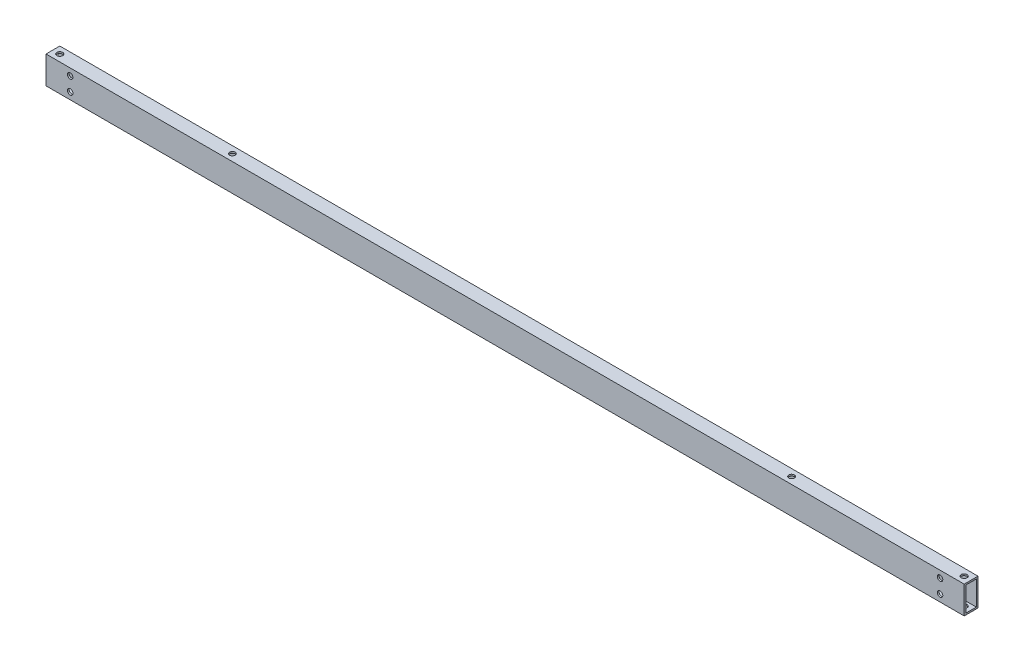
ISO-10303-21;
HEADER;
FILE_DESCRIPTION(('STEP AP214'),'2;1');
FILE_NAME('part.step','',(''),(''),'','','');
FILE_SCHEMA(('AUTOMOTIVE_DESIGN { 1 0 10303 214 1 1 1 1 }'));
ENDSEC;
DATA;
#1=APPLICATION_CONTEXT('core data for automotive mechanical design processes');
#2=APPLICATION_PROTOCOL_DEFINITION('international standard','automotive_design',2000,#1);
#3=PRODUCT_CONTEXT('',#1,'mechanical');
#4=PRODUCT('Part','Part','',(#3));
#5=PRODUCT_RELATED_PRODUCT_CATEGORY('part','',(#4));
#6=PRODUCT_DEFINITION_FORMATION('','',#4);
#7=PRODUCT_DEFINITION_CONTEXT('part definition',#1,'design');
#8=PRODUCT_DEFINITION('design','',#6,#7);
#9=PRODUCT_DEFINITION_SHAPE('','',#8);
#10=(LENGTH_UNIT() NAMED_UNIT(*) SI_UNIT(.MILLI.,.METRE.));
#11=(NAMED_UNIT(*) PLANE_ANGLE_UNIT() SI_UNIT($,.RADIAN.));
#12=(NAMED_UNIT(*) SI_UNIT($,.STERADIAN.) SOLID_ANGLE_UNIT());
#13=UNCERTAINTY_MEASURE_WITH_UNIT(LENGTH_MEASURE(1.E-05),#10,'distance_accuracy_value','');
#14=(GEOMETRIC_REPRESENTATION_CONTEXT(3) GLOBAL_UNCERTAINTY_ASSIGNED_CONTEXT((#13)) GLOBAL_UNIT_ASSIGNED_CONTEXT((#10,
#11,#12)) REPRESENTATION_CONTEXT('',''));
#15=CARTESIAN_POINT('',(0.,0.,0.));
#16=DIRECTION('',(0.,0.,1.));
#17=DIRECTION('',(1.,0.,0.));
#18=AXIS2_PLACEMENT_3D('',#15,#16,#17);
#19=CARTESIAN_POINT('',(665.,0.,0.));
#20=DIRECTION('',(1.,0.,0.));
#21=DIRECTION('',(0.,0.,-1.));
#22=AXIS2_PLACEMENT_3D('',#19,#20,#21);
#23=PLANE('',#22);
#24=DIRECTION('',(0.,1.,0.));
#25=VECTOR('',#24,1.);
#26=CARTESIAN_POINT('',(665.,10.,-5.));
#27=LINE('',#26,#25);
#28=CARTESIAN_POINT('',(665.,-10.,-5.));
#29=VERTEX_POINT('',#28);
#30=CARTESIAN_POINT('',(665.,10.,-5.));
#31=VERTEX_POINT('',#30);
#32=EDGE_CURVE('E181',#29,#31,#27,.T.);
#33=ORIENTED_EDGE('',*,*,#32,.T.);
#34=DIRECTION('',(0.,0.,1.));
#35=VECTOR('',#34,1.);
#36=CARTESIAN_POINT('',(665.,10.,5.));
#37=LINE('',#36,#35);
#38=CARTESIAN_POINT('',(665.,10.,5.));
#39=VERTEX_POINT('',#38);
#40=EDGE_CURVE('E185',#31,#39,#37,.T.);
#41=ORIENTED_EDGE('',*,*,#40,.T.);
#42=DIRECTION('',(0.,-1.,0.));
#43=VECTOR('',#42,1.);
#44=CARTESIAN_POINT('',(665.,10.,5.));
#45=LINE('',#44,#43);
#46=CARTESIAN_POINT('',(665.,-10.,5.));
#47=VERTEX_POINT('',#46);
#48=EDGE_CURVE('E189',#39,#47,#45,.T.);
#49=ORIENTED_EDGE('',*,*,#48,.T.);
#50=DIRECTION('',(0.,0.,-1.));
#51=VECTOR('',#50,1.);
#52=CARTESIAN_POINT('',(665.,-10.,5.));
#53=LINE('',#52,#51);
#54=EDGE_CURVE('E192',#47,#29,#53,.T.);
#55=ORIENTED_EDGE('',*,*,#54,.T.);
#56=EDGE_LOOP('',(#33,#41,#49,#55));
#57=FACE_BOUND('',#56,.T.);
#58=DIRECTION('',(0.,0.,1.));
#59=VECTOR('',#58,1.);
#60=CARTESIAN_POINT('',(665.,8.8,5.));
#61=LINE('',#60,#59);
#62=CARTESIAN_POINT('',(665.,8.8,-3.8));
#63=VERTEX_POINT('',#62);
#64=CARTESIAN_POINT('',(665.,8.8,3.8));
#65=VERTEX_POINT('',#64);
#66=EDGE_CURVE('E140',#63,#65,#61,.T.);
#67=ORIENTED_EDGE('',*,*,#66,.F.);
#68=DIRECTION('',(0.,1.,0.));
#69=VECTOR('',#68,1.);
#70=CARTESIAN_POINT('',(665.,10.,-3.8));
#71=LINE('',#70,#69);
#72=CARTESIAN_POINT('',(665.,-8.8,-3.8));
#73=VERTEX_POINT('',#72);
#74=EDGE_CURVE('E131',#73,#63,#71,.T.);
#75=ORIENTED_EDGE('',*,*,#74,.F.);
#76=DIRECTION('',(0.,0.,-1.));
#77=VECTOR('',#76,1.);
#78=CARTESIAN_POINT('',(665.,-8.8,5.));
#79=LINE('',#78,#77);
#80=CARTESIAN_POINT('',(665.,-8.8,3.8));
#81=VERTEX_POINT('',#80);
#82=EDGE_CURVE('E157',#81,#73,#79,.T.);
#83=ORIENTED_EDGE('',*,*,#82,.F.);
#84=DIRECTION('',(0.,-1.,0.));
#85=VECTOR('',#84,1.);
#86=CARTESIAN_POINT('',(665.,10.,3.8));
#87=LINE('',#86,#85);
#88=EDGE_CURVE('E153',#65,#81,#87,.T.);
#89=ORIENTED_EDGE('',*,*,#88,.F.);
#90=EDGE_LOOP('',(#67,#75,#83,#89));
#91=FACE_BOUND('',#90,.T.);
#92=ADVANCED_FACE('F63',(#57,#91),#23,.T.);
#93=CARTESIAN_POINT('',(0.,0.,0.));
#94=DIRECTION('',(1.,0.,0.));
#95=DIRECTION('',(0.,0.,-1.));
#96=AXIS2_PLACEMENT_3D('',#93,#94,#95);
#97=PLANE('',#96);
#98=DIRECTION('',(0.,1.,0.));
#99=VECTOR('',#98,1.);
#100=CARTESIAN_POINT('',(0.,10.,-5.));
#101=LINE('',#100,#99);
#102=CARTESIAN_POINT('',(0.,-10.,-5.));
#103=VERTEX_POINT('',#102);
#104=CARTESIAN_POINT('',(0.,10.,-5.));
#105=VERTEX_POINT('',#104);
#106=EDGE_CURVE('E149',#103,#105,#101,.T.);
#107=ORIENTED_EDGE('',*,*,#106,.F.);
#108=DIRECTION('',(0.,0.,-1.));
#109=VECTOR('',#108,1.);
#110=CARTESIAN_POINT('',(0.,-10.,5.));
#111=LINE('',#110,#109);
#112=CARTESIAN_POINT('',(0.,-10.,5.));
#113=VERTEX_POINT('',#112);
#114=EDGE_CURVE('E186',#113,#103,#111,.T.);
#115=ORIENTED_EDGE('',*,*,#114,.F.);
#116=DIRECTION('',(0.,-1.,0.));
#117=VECTOR('',#116,1.);
#118=CARTESIAN_POINT('',(0.,10.,5.));
#119=LINE('',#118,#117);
#120=CARTESIAN_POINT('',(0.,10.,5.));
#121=VERTEX_POINT('',#120);
#122=EDGE_CURVE('E202',#121,#113,#119,.T.);
#123=ORIENTED_EDGE('',*,*,#122,.F.);
#124=DIRECTION('',(0.,0.,1.));
#125=VECTOR('',#124,1.);
#126=CARTESIAN_POINT('',(0.,10.,5.));
#127=LINE('',#126,#125);
#128=EDGE_CURVE('E199',#105,#121,#127,.T.);
#129=ORIENTED_EDGE('',*,*,#128,.F.);
#130=EDGE_LOOP('',(#107,#115,#123,#129));
#131=FACE_BOUND('',#130,.T.);
#132=DIRECTION('',(0.,1.,0.));
#133=VECTOR('',#132,1.);
#134=CARTESIAN_POINT('',(0.,10.,-3.8));
#135=LINE('',#134,#133);
#136=CARTESIAN_POINT('',(0.,-8.8,-3.8));
#137=VERTEX_POINT('',#136);
#138=CARTESIAN_POINT('',(0.,8.8,-3.8));
#139=VERTEX_POINT('',#138);
#140=EDGE_CURVE('E89',#137,#139,#135,.T.);
#141=ORIENTED_EDGE('',*,*,#140,.T.);
#142=DIRECTION('',(0.,0.,1.));
#143=VECTOR('',#142,1.);
#144=CARTESIAN_POINT('',(0.,8.8,5.));
#145=LINE('',#144,#143);
#146=CARTESIAN_POINT('',(0.,8.8,3.8));
#147=VERTEX_POINT('',#146);
#148=EDGE_CURVE('E147',#139,#147,#145,.T.);
#149=ORIENTED_EDGE('',*,*,#148,.T.);
#150=DIRECTION('',(0.,-1.,0.));
#151=VECTOR('',#150,1.);
#152=CARTESIAN_POINT('',(0.,10.,3.8));
#153=LINE('',#152,#151);
#154=CARTESIAN_POINT('',(0.,-8.8,3.8));
#155=VERTEX_POINT('',#154);
#156=EDGE_CURVE('E168',#147,#155,#153,.T.);
#157=ORIENTED_EDGE('',*,*,#156,.T.);
#158=DIRECTION('',(0.,0.,-1.));
#159=VECTOR('',#158,1.);
#160=CARTESIAN_POINT('',(0.,-8.8,5.));
#161=LINE('',#160,#159);
#162=EDGE_CURVE('E141',#155,#137,#161,.T.);
#163=ORIENTED_EDGE('',*,*,#162,.T.);
#164=EDGE_LOOP('',(#141,#149,#157,#163));
#165=FACE_BOUND('',#164,.T.);
#166=ADVANCED_FACE('F336',(#131,#165),#97,.F.);
#167=CARTESIAN_POINT('',(665.,10.,-5.));
#168=DIRECTION('',(0.,0.,1.));
#169=DIRECTION('',(0.,-1.,0.));
#170=AXIS2_PLACEMENT_3D('',#167,#168,#169);
#171=PLANE('',#170);
#172=CARTESIAN_POINT('',(17.5,4.99999999999992,-5.));
#173=DIRECTION('',(0.,0.,1.));
#174=DIRECTION('',(-1.,0.,0.));
#175=AXIS2_PLACEMENT_3D('',#172,#173,#174);
#176=CIRCLE('',#175,2.);
#177=CARTESIAN_POINT('',(15.5,4.99999999999992,-5.));
#178=VERTEX_POINT('',#177);
#179=EDGE_CURVE('E286',#178,#178,#176,.T.);
#180=ORIENTED_EDGE('',*,*,#179,.T.);
#181=EDGE_LOOP('',(#180));
#182=FACE_BOUND('',#181,.T.);
#183=CARTESIAN_POINT('',(17.5,-5.00000000000008,-5.));
#184=DIRECTION('',(0.,0.,1.));
#185=DIRECTION('',(1.,0.,0.));
#186=AXIS2_PLACEMENT_3D('',#183,#184,#185);
#187=CIRCLE('',#186,2.);
#188=CARTESIAN_POINT('',(19.5,-5.00000000000008,-5.));
#189=VERTEX_POINT('',#188);
#190=EDGE_CURVE('E278',#189,#189,#187,.T.);
#191=ORIENTED_EDGE('',*,*,#190,.T.);
#192=EDGE_LOOP('',(#191));
#193=FACE_BOUND('',#192,.T.);
#194=CARTESIAN_POINT('',(647.5,-5.,-5.));
#195=DIRECTION('',(0.,0.,1.));
#196=DIRECTION('',(-1.,0.,0.));
#197=AXIS2_PLACEMENT_3D('',#194,#195,#196);
#198=CIRCLE('',#197,2.);
#199=CARTESIAN_POINT('',(645.5,-5.,-5.));
#200=VERTEX_POINT('',#199);
#201=EDGE_CURVE('E269',#200,#200,#198,.T.);
#202=ORIENTED_EDGE('',*,*,#201,.T.);
#203=EDGE_LOOP('',(#202));
#204=FACE_BOUND('',#203,.T.);
#205=CARTESIAN_POINT('',(647.5,5.,-5.));
#206=DIRECTION('',(0.,0.,1.));
#207=DIRECTION('',(1.,0.,0.));
#208=AXIS2_PLACEMENT_3D('',#205,#206,#207);
#209=CIRCLE('',#208,2.);
#210=CARTESIAN_POINT('',(649.5,5.,-5.));
#211=VERTEX_POINT('',#210);
#212=EDGE_CURVE('E222',#211,#211,#209,.T.);
#213=ORIENTED_EDGE('',*,*,#212,.T.);
#214=EDGE_LOOP('',(#213));
#215=FACE_BOUND('',#214,.T.);
#216=ORIENTED_EDGE('',*,*,#106,.T.);
#217=DIRECTION('',(-1.,0.,0.));
#218=VECTOR('',#217,1.);
#219=CARTESIAN_POINT('',(665.,10.,-5.));
#220=LINE('',#219,#218);
#221=EDGE_CURVE('E12',#31,#105,#220,.T.);
#222=ORIENTED_EDGE('',*,*,#221,.F.);
#223=ORIENTED_EDGE('',*,*,#32,.F.);
#224=DIRECTION('',(-1.,0.,0.));
#225=VECTOR('',#224,1.);
#226=CARTESIAN_POINT('',(665.,-10.,-5.));
#227=LINE('',#226,#225);
#228=EDGE_CURVE('E195',#29,#103,#227,.T.);
#229=ORIENTED_EDGE('',*,*,#228,.T.);
#230=EDGE_LOOP('',(#216,#222,#223,#229));
#231=FACE_BOUND('',#230,.T.);
#232=ADVANCED_FACE('F65',(#182,#193,#204,#215,#231),#171,.F.);
#233=CARTESIAN_POINT('',(665.,10.,5.));
#234=DIRECTION('',(0.,-1.,0.));
#235=DIRECTION('',(0.,0.,-1.));
#236=AXIS2_PLACEMENT_3D('',#233,#234,#235);
#237=PLANE('',#236);
#238=CARTESIAN_POINT('',(5.,10.,0.));
#239=DIRECTION('',(0.,1.,0.));
#240=DIRECTION('',(0.,0.,1.));
#241=AXIS2_PLACEMENT_3D('',#238,#239,#240);
#242=CIRCLE('',#241,2.1);
#243=CARTESIAN_POINT('',(5.,10.,2.1));
#244=VERTEX_POINT('',#243);
#245=EDGE_CURVE('E433',#244,#244,#242,.T.);
#246=ORIENTED_EDGE('',*,*,#245,.F.);
#247=EDGE_LOOP('',(#246));
#248=FACE_BOUND('',#247,.T.);
#249=CARTESIAN_POINT('',(535.,10.,0.));
#250=DIRECTION('',(0.,1.,0.));
#251=DIRECTION('',(0.,0.,-1.));
#252=AXIS2_PLACEMENT_3D('',#249,#250,#251);
#253=CIRCLE('',#252,2.);
#254=CARTESIAN_POINT('',(535.,10.,-2.00000000000008));
#255=VERTEX_POINT('',#254);
#256=EDGE_CURVE('E450',#255,#255,#253,.T.);
#257=ORIENTED_EDGE('',*,*,#256,.F.);
#258=EDGE_LOOP('',(#257));
#259=FACE_BOUND('',#258,.T.);
#260=CARTESIAN_POINT('',(130.,10.,0.));
#261=DIRECTION('',(0.,1.,0.));
#262=DIRECTION('',(0.,0.,1.));
#263=AXIS2_PLACEMENT_3D('',#260,#261,#262);
#264=CIRCLE('',#263,2.);
#265=CARTESIAN_POINT('',(130.,10.,1.99999999999997));
#266=VERTEX_POINT('',#265);
#267=EDGE_CURVE('E449',#266,#266,#264,.T.);
#268=ORIENTED_EDGE('',*,*,#267,.F.);
#269=EDGE_LOOP('',(#268));
#270=FACE_BOUND('',#269,.T.);
#271=CARTESIAN_POINT('',(660.,10.,0.));
#272=DIRECTION('',(0.,1.,0.));
#273=DIRECTION('',(0.,0.,-1.));
#274=AXIS2_PLACEMENT_3D('',#271,#272,#273);
#275=CIRCLE('',#274,2.10000000000004);
#276=CARTESIAN_POINT('',(660.,10.,-2.10000000000012));
#277=VERTEX_POINT('',#276);
#278=EDGE_CURVE('E442',#277,#277,#275,.T.);
#279=ORIENTED_EDGE('',*,*,#278,.F.);
#280=EDGE_LOOP('',(#279));
#281=FACE_BOUND('',#280,.T.);
#282=ORIENTED_EDGE('',*,*,#128,.T.);
#283=DIRECTION('',(-1.,0.,0.));
#284=VECTOR('',#283,1.);
#285=CARTESIAN_POINT('',(665.,10.,5.));
#286=LINE('',#285,#284);
#287=EDGE_CURVE('E73',#39,#121,#286,.T.);
#288=ORIENTED_EDGE('',*,*,#287,.F.);
#289=ORIENTED_EDGE('',*,*,#40,.F.);
#290=ORIENTED_EDGE('',*,*,#221,.T.);
#291=EDGE_LOOP('',(#282,#288,#289,#290));
#292=FACE_BOUND('',#291,.T.);
#293=ADVANCED_FACE('F335',(#248,#259,#270,#281,#292),#237,.F.);
#294=CARTESIAN_POINT('',(665.,10.,5.));
#295=DIRECTION('',(0.,0.,-1.));
#296=DIRECTION('',(0.,1.,0.));
#297=AXIS2_PLACEMENT_3D('',#294,#295,#296);
#298=PLANE('',#297);
#299=CARTESIAN_POINT('',(17.5,4.99999999999992,5.));
#300=DIRECTION('',(0.,0.,1.));
#301=DIRECTION('',(-1.,0.,0.));
#302=AXIS2_PLACEMENT_3D('',#299,#300,#301);
#303=CIRCLE('',#302,2.);
#304=CARTESIAN_POINT('',(15.5,4.99999999999992,5.));
#305=VERTEX_POINT('',#304);
#306=EDGE_CURVE('E268',#305,#305,#303,.T.);
#307=ORIENTED_EDGE('',*,*,#306,.F.);
#308=EDGE_LOOP('',(#307));
#309=FACE_BOUND('',#308,.T.);
#310=CARTESIAN_POINT('',(17.5,-5.00000000000008,5.));
#311=DIRECTION('',(0.,0.,1.));
#312=DIRECTION('',(1.,0.,0.));
#313=AXIS2_PLACEMENT_3D('',#310,#311,#312);
#314=CIRCLE('',#313,2.);
#315=CARTESIAN_POINT('',(19.5,-5.00000000000008,5.));
#316=VERTEX_POINT('',#315);
#317=EDGE_CURVE('E282',#316,#316,#314,.T.);
#318=ORIENTED_EDGE('',*,*,#317,.F.);
#319=EDGE_LOOP('',(#318));
#320=FACE_BOUND('',#319,.T.);
#321=CARTESIAN_POINT('',(647.5,-5.,5.));
#322=DIRECTION('',(0.,0.,1.));
#323=DIRECTION('',(-1.,0.,0.));
#324=AXIS2_PLACEMENT_3D('',#321,#322,#323);
#325=CIRCLE('',#324,2.);
#326=CARTESIAN_POINT('',(645.5,-5.,5.));
#327=VERTEX_POINT('',#326);
#328=EDGE_CURVE('E274',#327,#327,#325,.T.);
#329=ORIENTED_EDGE('',*,*,#328,.F.);
#330=EDGE_LOOP('',(#329));
#331=FACE_BOUND('',#330,.T.);
#332=CARTESIAN_POINT('',(647.5,5.,5.));
#333=DIRECTION('',(0.,0.,1.));
#334=DIRECTION('',(1.,0.,0.));
#335=AXIS2_PLACEMENT_3D('',#332,#333,#334);
#336=CIRCLE('',#335,2.);
#337=CARTESIAN_POINT('',(649.5,5.,5.));
#338=VERTEX_POINT('',#337);
#339=EDGE_CURVE('E273',#338,#338,#336,.T.);
#340=ORIENTED_EDGE('',*,*,#339,.F.);
#341=EDGE_LOOP('',(#340));
#342=FACE_BOUND('',#341,.T.);
#343=ORIENTED_EDGE('',*,*,#122,.T.);
#344=DIRECTION('',(-1.,0.,0.));
#345=VECTOR('',#344,1.);
#346=CARTESIAN_POINT('',(665.,-10.,5.));
#347=LINE('',#346,#345);
#348=EDGE_CURVE('E210',#47,#113,#347,.T.);
#349=ORIENTED_EDGE('',*,*,#348,.F.);
#350=ORIENTED_EDGE('',*,*,#48,.F.);
#351=ORIENTED_EDGE('',*,*,#287,.T.);
#352=EDGE_LOOP('',(#343,#349,#350,#351));
#353=FACE_BOUND('',#352,.T.);
#354=ADVANCED_FACE('F354',(#309,#320,#331,#342,#353),#298,.F.);
#355=CARTESIAN_POINT('',(665.,-10.,5.));
#356=DIRECTION('',(0.,1.,0.));
#357=DIRECTION('',(0.,0.,1.));
#358=AXIS2_PLACEMENT_3D('',#355,#356,#357);
#359=PLANE('',#358);
#360=CARTESIAN_POINT('',(5.,-10.,0.));
#361=DIRECTION('',(0.,1.,0.));
#362=DIRECTION('',(0.,0.,1.));
#363=AXIS2_PLACEMENT_3D('',#360,#361,#362);
#364=CIRCLE('',#363,2.1);
#365=CARTESIAN_POINT('',(5.,-10.,2.1));
#366=VERTEX_POINT('',#365);
#367=EDGE_CURVE('E242',#366,#366,#364,.T.);
#368=ORIENTED_EDGE('',*,*,#367,.T.);
#369=EDGE_LOOP('',(#368));
#370=FACE_BOUND('',#369,.T.);
#371=CARTESIAN_POINT('',(535.,-10.,0.));
#372=DIRECTION('',(0.,1.,0.));
#373=DIRECTION('',(0.,0.,-1.));
#374=AXIS2_PLACEMENT_3D('',#371,#372,#373);
#375=CIRCLE('',#374,2.);
#376=CARTESIAN_POINT('',(535.,-10.,-2.00000000000008));
#377=VERTEX_POINT('',#376);
#378=EDGE_CURVE('E445',#377,#377,#375,.T.);
#379=ORIENTED_EDGE('',*,*,#378,.T.);
#380=EDGE_LOOP('',(#379));
#381=FACE_BOUND('',#380,.T.);
#382=CARTESIAN_POINT('',(130.,-10.,0.));
#383=DIRECTION('',(0.,1.,0.));
#384=DIRECTION('',(0.,0.,1.));
#385=AXIS2_PLACEMENT_3D('',#382,#383,#384);
#386=CIRCLE('',#385,2.);
#387=CARTESIAN_POINT('',(130.,-10.,1.99999999999997));
#388=VERTEX_POINT('',#387);
#389=EDGE_CURVE('E457',#388,#388,#386,.T.);
#390=ORIENTED_EDGE('',*,*,#389,.T.);
#391=EDGE_LOOP('',(#390));
#392=FACE_BOUND('',#391,.T.);
#393=CARTESIAN_POINT('',(660.,-10.,0.));
#394=DIRECTION('',(0.,1.,0.));
#395=DIRECTION('',(0.,0.,-1.));
#396=AXIS2_PLACEMENT_3D('',#393,#394,#395);
#397=CIRCLE('',#396,2.10000000000004);
#398=CARTESIAN_POINT('',(660.,-10.,-2.10000000000012));
#399=VERTEX_POINT('',#398);
#400=EDGE_CURVE('E435',#399,#399,#397,.T.);
#401=ORIENTED_EDGE('',*,*,#400,.T.);
#402=EDGE_LOOP('',(#401));
#403=FACE_BOUND('',#402,.T.);
#404=ORIENTED_EDGE('',*,*,#114,.T.);
#405=ORIENTED_EDGE('',*,*,#228,.F.);
#406=ORIENTED_EDGE('',*,*,#54,.F.);
#407=ORIENTED_EDGE('',*,*,#348,.T.);
#408=EDGE_LOOP('',(#404,#405,#406,#407));
#409=FACE_BOUND('',#408,.T.);
#410=ADVANCED_FACE('F316',(#370,#381,#392,#403,#409),#359,.F.);
#411=CARTESIAN_POINT('',(665.,10.,-3.8));
#412=DIRECTION('',(0.,0.,1.));
#413=DIRECTION('',(0.,-1.,0.));
#414=AXIS2_PLACEMENT_3D('',#411,#412,#413);
#415=PLANE('',#414);
#416=CARTESIAN_POINT('',(17.5,4.99999999999992,-3.8));
#417=DIRECTION('',(0.,0.,1.));
#418=DIRECTION('',(0.,-1.,0.));
#419=AXIS2_PLACEMENT_3D('',#416,#417,#418);
#420=CIRCLE('',#419,2.);
#421=CARTESIAN_POINT('',(17.5,2.99999999999993,-3.8));
#422=VERTEX_POINT('',#421);
#423=EDGE_CURVE('E165',#422,#422,#420,.T.);
#424=ORIENTED_EDGE('',*,*,#423,.F.);
#425=EDGE_LOOP('',(#424));
#426=FACE_BOUND('',#425,.T.);
#427=CARTESIAN_POINT('',(17.5,-5.00000000000008,-3.8));
#428=DIRECTION('',(0.,0.,1.));
#429=DIRECTION('',(0.,-1.,0.));
#430=AXIS2_PLACEMENT_3D('',#427,#428,#429);
#431=CIRCLE('',#430,2.);
#432=CARTESIAN_POINT('',(17.5,-7.00000000000007,-3.8));
#433=VERTEX_POINT('',#432);
#434=EDGE_CURVE('E232',#433,#433,#431,.T.);
#435=ORIENTED_EDGE('',*,*,#434,.F.);
#436=EDGE_LOOP('',(#435));
#437=FACE_BOUND('',#436,.T.);
#438=CARTESIAN_POINT('',(647.5,-5.,-3.8));
#439=DIRECTION('',(0.,0.,1.));
#440=DIRECTION('',(0.,-1.,0.));
#441=AXIS2_PLACEMENT_3D('',#438,#439,#440);
#442=CIRCLE('',#441,2.);
#443=CARTESIAN_POINT('',(647.5,-7.,-3.8));
#444=VERTEX_POINT('',#443);
#445=EDGE_CURVE('E227',#444,#444,#442,.T.);
#446=ORIENTED_EDGE('',*,*,#445,.F.);
#447=EDGE_LOOP('',(#446));
#448=FACE_BOUND('',#447,.T.);
#449=CARTESIAN_POINT('',(647.5,5.,-3.8));
#450=DIRECTION('',(0.,0.,1.));
#451=DIRECTION('',(0.,-1.,0.));
#452=AXIS2_PLACEMENT_3D('',#449,#450,#451);
#453=CIRCLE('',#452,2.);
#454=CARTESIAN_POINT('',(647.5,3.,-3.8));
#455=VERTEX_POINT('',#454);
#456=EDGE_CURVE('E221',#455,#455,#453,.T.);
#457=ORIENTED_EDGE('',*,*,#456,.F.);
#458=EDGE_LOOP('',(#457));
#459=FACE_BOUND('',#458,.T.);
#460=ORIENTED_EDGE('',*,*,#140,.F.);
#461=DIRECTION('',(-1.,0.,0.));
#462=VECTOR('',#461,1.);
#463=CARTESIAN_POINT('',(665.,-8.8,-3.8));
#464=LINE('',#463,#462);
#465=EDGE_CURVE('E135',#73,#137,#464,.T.);
#466=ORIENTED_EDGE('',*,*,#465,.F.);
#467=ORIENTED_EDGE('',*,*,#74,.T.);
#468=DIRECTION('',(-1.,0.,0.));
#469=VECTOR('',#468,1.);
#470=CARTESIAN_POINT('',(665.,8.8,-3.8));
#471=LINE('',#470,#469);
#472=EDGE_CURVE('E134',#63,#139,#471,.T.);
#473=ORIENTED_EDGE('',*,*,#472,.T.);
#474=EDGE_LOOP('',(#460,#466,#467,#473));
#475=FACE_BOUND('',#474,.T.);
#476=ADVANCED_FACE('F133',(#426,#437,#448,#459,#475),#415,.T.);
#477=CARTESIAN_POINT('',(665.,8.8,5.));
#478=DIRECTION('',(0.,-1.,0.));
#479=DIRECTION('',(0.,0.,-1.));
#480=AXIS2_PLACEMENT_3D('',#477,#478,#479);
#481=PLANE('',#480);
#482=CARTESIAN_POINT('',(5.,8.8,0.));
#483=DIRECTION('',(0.,-1.,0.));
#484=DIRECTION('',(0.,0.,-1.));
#485=AXIS2_PLACEMENT_3D('',#482,#483,#484);
#486=CIRCLE('',#485,2.1);
#487=CARTESIAN_POINT('',(5.,8.8,-2.1));
#488=VERTEX_POINT('',#487);
#489=EDGE_CURVE('E264',#488,#488,#486,.T.);
#490=ORIENTED_EDGE('',*,*,#489,.F.);
#491=EDGE_LOOP('',(#490));
#492=FACE_BOUND('',#491,.T.);
#493=CARTESIAN_POINT('',(535.,8.8,0.));
#494=DIRECTION('',(0.,-1.,0.));
#495=DIRECTION('',(0.,0.,-1.));
#496=AXIS2_PLACEMENT_3D('',#493,#494,#495);
#497=CIRCLE('',#496,2.);
#498=CARTESIAN_POINT('',(535.,8.8,-2.00000000000008));
#499=VERTEX_POINT('',#498);
#500=EDGE_CURVE('E250',#499,#499,#497,.T.);
#501=ORIENTED_EDGE('',*,*,#500,.F.);
#502=EDGE_LOOP('',(#501));
#503=FACE_BOUND('',#502,.T.);
#504=CARTESIAN_POINT('',(130.,8.8,0.));
#505=DIRECTION('',(0.,-1.,0.));
#506=DIRECTION('',(0.,0.,-1.));
#507=AXIS2_PLACEMENT_3D('',#504,#505,#506);
#508=CIRCLE('',#507,2.);
#509=CARTESIAN_POINT('',(130.,8.8,-2.00000000000003));
#510=VERTEX_POINT('',#509);
#511=EDGE_CURVE('E246',#510,#510,#508,.T.);
#512=ORIENTED_EDGE('',*,*,#511,.F.);
#513=EDGE_LOOP('',(#512));
#514=FACE_BOUND('',#513,.T.);
#515=CARTESIAN_POINT('',(660.,8.8,0.));
#516=DIRECTION('',(0.,-1.,0.));
#517=DIRECTION('',(0.,0.,-1.));
#518=AXIS2_PLACEMENT_3D('',#515,#516,#517);
#519=CIRCLE('',#518,2.10000000000004);
#520=CARTESIAN_POINT('',(660.,8.8,-2.10000000000012));
#521=VERTEX_POINT('',#520);
#522=EDGE_CURVE('E241',#521,#521,#519,.T.);
#523=ORIENTED_EDGE('',*,*,#522,.F.);
#524=EDGE_LOOP('',(#523));
#525=FACE_BOUND('',#524,.T.);
#526=ORIENTED_EDGE('',*,*,#148,.F.);
#527=ORIENTED_EDGE('',*,*,#472,.F.);
#528=ORIENTED_EDGE('',*,*,#66,.T.);
#529=DIRECTION('',(-1.,0.,0.));
#530=VECTOR('',#529,1.);
#531=CARTESIAN_POINT('',(665.,8.8,3.8));
#532=LINE('',#531,#530);
#533=EDGE_CURVE('E150',#65,#147,#532,.T.);
#534=ORIENTED_EDGE('',*,*,#533,.T.);
#535=EDGE_LOOP('',(#526,#527,#528,#534));
#536=FACE_BOUND('',#535,.T.);
#537=ADVANCED_FACE('F144',(#492,#503,#514,#525,#536),#481,.T.);
#538=CARTESIAN_POINT('',(665.,10.,3.8));
#539=DIRECTION('',(0.,0.,-1.));
#540=DIRECTION('',(0.,1.,0.));
#541=AXIS2_PLACEMENT_3D('',#538,#539,#540);
#542=PLANE('',#541);
#543=CARTESIAN_POINT('',(17.5,4.99999999999992,3.8));
#544=DIRECTION('',(0.,0.,-1.));
#545=DIRECTION('',(0.,1.,0.));
#546=AXIS2_PLACEMENT_3D('',#543,#544,#545);
#547=CIRCLE('',#546,2.);
#548=CARTESIAN_POINT('',(17.5,6.99999999999992,3.8));
#549=VERTEX_POINT('',#548);
#550=EDGE_CURVE('E233',#549,#549,#547,.T.);
#551=ORIENTED_EDGE('',*,*,#550,.F.);
#552=EDGE_LOOP('',(#551));
#553=FACE_BOUND('',#552,.T.);
#554=CARTESIAN_POINT('',(17.5,-5.00000000000008,3.8));
#555=DIRECTION('',(0.,0.,-1.));
#556=DIRECTION('',(0.,1.,0.));
#557=AXIS2_PLACEMENT_3D('',#554,#555,#556);
#558=CIRCLE('',#557,2.);
#559=CARTESIAN_POINT('',(17.5,-3.00000000000008,3.8));
#560=VERTEX_POINT('',#559);
#561=EDGE_CURVE('E228',#560,#560,#558,.T.);
#562=ORIENTED_EDGE('',*,*,#561,.F.);
#563=EDGE_LOOP('',(#562));
#564=FACE_BOUND('',#563,.T.);
#565=CARTESIAN_POINT('',(647.5,-5.,3.8));
#566=DIRECTION('',(0.,0.,-1.));
#567=DIRECTION('',(0.,1.,0.));
#568=AXIS2_PLACEMENT_3D('',#565,#566,#567);
#569=CIRCLE('',#568,2.);
#570=CARTESIAN_POINT('',(647.5,-3.00000000000001,3.8));
#571=VERTEX_POINT('',#570);
#572=EDGE_CURVE('E223',#571,#571,#569,.T.);
#573=ORIENTED_EDGE('',*,*,#572,.F.);
#574=EDGE_LOOP('',(#573));
#575=FACE_BOUND('',#574,.T.);
#576=CARTESIAN_POINT('',(647.5,5.,3.8));
#577=DIRECTION('',(0.,0.,-1.));
#578=DIRECTION('',(0.,1.,0.));
#579=AXIS2_PLACEMENT_3D('',#576,#577,#578);
#580=CIRCLE('',#579,2.);
#581=CARTESIAN_POINT('',(647.5,6.99999999999999,3.8));
#582=VERTEX_POINT('',#581);
#583=EDGE_CURVE('E217',#582,#582,#580,.T.);
#584=ORIENTED_EDGE('',*,*,#583,.F.);
#585=EDGE_LOOP('',(#584));
#586=FACE_BOUND('',#585,.T.);
#587=ORIENTED_EDGE('',*,*,#156,.F.);
#588=ORIENTED_EDGE('',*,*,#533,.F.);
#589=ORIENTED_EDGE('',*,*,#88,.T.);
#590=DIRECTION('',(-1.,0.,0.));
#591=VECTOR('',#590,1.);
#592=CARTESIAN_POINT('',(665.,-8.8,3.8));
#593=LINE('',#592,#591);
#594=EDGE_CURVE('E81',#81,#155,#593,.T.);
#595=ORIENTED_EDGE('',*,*,#594,.T.);
#596=EDGE_LOOP('',(#587,#588,#589,#595));
#597=FACE_BOUND('',#596,.T.);
#598=ADVANCED_FACE('F376',(#553,#564,#575,#586,#597),#542,.T.);
#599=CARTESIAN_POINT('',(665.,-8.8,5.));
#600=DIRECTION('',(0.,1.,0.));
#601=DIRECTION('',(0.,0.,1.));
#602=AXIS2_PLACEMENT_3D('',#599,#600,#601);
#603=PLANE('',#602);
#604=CARTESIAN_POINT('',(5.,-8.8,0.));
#605=DIRECTION('',(0.,1.,0.));
#606=DIRECTION('',(0.,0.,1.));
#607=AXIS2_PLACEMENT_3D('',#604,#605,#606);
#608=CIRCLE('',#607,2.1);
#609=CARTESIAN_POINT('',(5.,-8.8,2.1));
#610=VERTEX_POINT('',#609);
#611=EDGE_CURVE('E67',#610,#610,#608,.T.);
#612=ORIENTED_EDGE('',*,*,#611,.F.);
#613=EDGE_LOOP('',(#612));
#614=FACE_BOUND('',#613,.T.);
#615=CARTESIAN_POINT('',(535.,-8.8,0.));
#616=DIRECTION('',(0.,1.,0.));
#617=DIRECTION('',(0.,0.,1.));
#618=AXIS2_PLACEMENT_3D('',#615,#616,#617);
#619=CIRCLE('',#618,2.);
#620=CARTESIAN_POINT('',(535.,-8.8,1.99999999999992));
#621=VERTEX_POINT('',#620);
#622=EDGE_CURVE('E247',#621,#621,#619,.T.);
#623=ORIENTED_EDGE('',*,*,#622,.F.);
#624=EDGE_LOOP('',(#623));
#625=FACE_BOUND('',#624,.T.);
#626=CARTESIAN_POINT('',(130.,-8.8,0.));
#627=DIRECTION('',(0.,1.,0.));
#628=DIRECTION('',(0.,0.,1.));
#629=AXIS2_PLACEMENT_3D('',#626,#627,#628);
#630=CIRCLE('',#629,2.);
#631=CARTESIAN_POINT('',(130.,-8.8,1.99999999999997));
#632=VERTEX_POINT('',#631);
#633=EDGE_CURVE('E243',#632,#632,#630,.T.);
#634=ORIENTED_EDGE('',*,*,#633,.F.);
#635=EDGE_LOOP('',(#634));
#636=FACE_BOUND('',#635,.T.);
#637=CARTESIAN_POINT('',(660.,-8.8,0.));
#638=DIRECTION('',(0.,1.,0.));
#639=DIRECTION('',(0.,0.,1.));
#640=AXIS2_PLACEMENT_3D('',#637,#638,#639);
#641=CIRCLE('',#640,2.10000000000004);
#642=CARTESIAN_POINT('',(660.,-8.8,2.09999999999996));
#643=VERTEX_POINT('',#642);
#644=EDGE_CURVE('E237',#643,#643,#641,.T.);
#645=ORIENTED_EDGE('',*,*,#644,.F.);
#646=EDGE_LOOP('',(#645));
#647=FACE_BOUND('',#646,.T.);
#648=ORIENTED_EDGE('',*,*,#162,.F.);
#649=ORIENTED_EDGE('',*,*,#594,.F.);
#650=ORIENTED_EDGE('',*,*,#82,.T.);
#651=ORIENTED_EDGE('',*,*,#465,.T.);
#652=EDGE_LOOP('',(#648,#649,#650,#651));
#653=FACE_BOUND('',#652,.T.);
#654=ADVANCED_FACE('F380',(#614,#625,#636,#647,#653),#603,.T.);
#655=CARTESIAN_POINT('',(647.5,5.,-5.));
#656=DIRECTION('',(0.,0.,1.));
#657=DIRECTION('',(1.,0.,0.));
#658=AXIS2_PLACEMENT_3D('',#655,#656,#657);
#659=CYLINDRICAL_SURFACE('',#658,2.);
#660=ORIENTED_EDGE('',*,*,#583,.T.);
#661=EDGE_LOOP('',(#660));
#662=FACE_BOUND('',#661,.T.);
#663=ORIENTED_EDGE('',*,*,#339,.T.);
#664=EDGE_LOOP('',(#663));
#665=FACE_BOUND('',#664,.T.);
#666=ADVANCED_FACE('F330',(#662,#665),#659,.F.);
#667=CARTESIAN_POINT('',(647.5,-5.,-5.));
#668=DIRECTION('',(0.,0.,1.));
#669=DIRECTION('',(1.,0.,0.));
#670=AXIS2_PLACEMENT_3D('',#667,#668,#669);
#671=CYLINDRICAL_SURFACE('',#670,2.);
#672=ORIENTED_EDGE('',*,*,#572,.T.);
#673=EDGE_LOOP('',(#672));
#674=FACE_BOUND('',#673,.T.);
#675=ORIENTED_EDGE('',*,*,#328,.T.);
#676=EDGE_LOOP('',(#675));
#677=FACE_BOUND('',#676,.T.);
#678=ADVANCED_FACE('F386',(#674,#677),#671,.F.);
#679=CARTESIAN_POINT('',(17.5,-5.00000000000008,-5.));
#680=DIRECTION('',(0.,0.,1.));
#681=DIRECTION('',(1.,0.,0.));
#682=AXIS2_PLACEMENT_3D('',#679,#680,#681);
#683=CYLINDRICAL_SURFACE('',#682,2.);
#684=ORIENTED_EDGE('',*,*,#561,.T.);
#685=EDGE_LOOP('',(#684));
#686=FACE_BOUND('',#685,.T.);
#687=ORIENTED_EDGE('',*,*,#317,.T.);
#688=EDGE_LOOP('',(#687));
#689=FACE_BOUND('',#688,.T.);
#690=ADVANCED_FACE('F390',(#686,#689),#683,.F.);
#691=CARTESIAN_POINT('',(17.5,4.99999999999992,-5.));
#692=DIRECTION('',(0.,0.,1.));
#693=DIRECTION('',(1.,0.,0.));
#694=AXIS2_PLACEMENT_3D('',#691,#692,#693);
#695=CYLINDRICAL_SURFACE('',#694,2.);
#696=ORIENTED_EDGE('',*,*,#550,.T.);
#697=EDGE_LOOP('',(#696));
#698=FACE_BOUND('',#697,.T.);
#699=ORIENTED_EDGE('',*,*,#306,.T.);
#700=EDGE_LOOP('',(#699));
#701=FACE_BOUND('',#700,.T.);
#702=ADVANCED_FACE('F328',(#698,#701),#695,.F.);
#703=ORIENTED_EDGE('',*,*,#456,.T.);
#704=EDGE_LOOP('',(#703));
#705=FACE_BOUND('',#704,.T.);
#706=ORIENTED_EDGE('',*,*,#212,.F.);
#707=EDGE_LOOP('',(#706));
#708=FACE_BOUND('',#707,.T.);
#709=ADVANCED_FACE('F324',(#705,#708),#659,.F.);
#710=ORIENTED_EDGE('',*,*,#445,.T.);
#711=EDGE_LOOP('',(#710));
#712=FACE_BOUND('',#711,.T.);
#713=ORIENTED_EDGE('',*,*,#201,.F.);
#714=EDGE_LOOP('',(#713));
#715=FACE_BOUND('',#714,.T.);
#716=ADVANCED_FACE('F327',(#712,#715),#671,.F.);
#717=ORIENTED_EDGE('',*,*,#434,.T.);
#718=EDGE_LOOP('',(#717));
#719=FACE_BOUND('',#718,.T.);
#720=ORIENTED_EDGE('',*,*,#190,.F.);
#721=EDGE_LOOP('',(#720));
#722=FACE_BOUND('',#721,.T.);
#723=ADVANCED_FACE('F395',(#719,#722),#683,.F.);
#724=ORIENTED_EDGE('',*,*,#423,.T.);
#725=EDGE_LOOP('',(#724));
#726=FACE_BOUND('',#725,.T.);
#727=ORIENTED_EDGE('',*,*,#179,.F.);
#728=EDGE_LOOP('',(#727));
#729=FACE_BOUND('',#728,.T.);
#730=ADVANCED_FACE('F311',(#726,#729),#695,.F.);
#731=CARTESIAN_POINT('',(660.,-10.,0.));
#732=DIRECTION('',(0.,1.,0.));
#733=DIRECTION('',(0.,0.,1.));
#734=AXIS2_PLACEMENT_3D('',#731,#732,#733);
#735=CYLINDRICAL_SURFACE('',#734,2.10000000000004);
#736=ORIENTED_EDGE('',*,*,#644,.T.);
#737=EDGE_LOOP('',(#736));
#738=FACE_BOUND('',#737,.T.);
#739=ORIENTED_EDGE('',*,*,#400,.F.);
#740=EDGE_LOOP('',(#739));
#741=FACE_BOUND('',#740,.T.);
#742=ADVANCED_FACE('F403',(#738,#741),#735,.F.);
#743=CARTESIAN_POINT('',(130.,-10.,0.));
#744=DIRECTION('',(0.,1.,0.));
#745=DIRECTION('',(0.,0.,1.));
#746=AXIS2_PLACEMENT_3D('',#743,#744,#745);
#747=CYLINDRICAL_SURFACE('',#746,2.);
#748=ORIENTED_EDGE('',*,*,#633,.T.);
#749=EDGE_LOOP('',(#748));
#750=FACE_BOUND('',#749,.T.);
#751=ORIENTED_EDGE('',*,*,#389,.F.);
#752=EDGE_LOOP('',(#751));
#753=FACE_BOUND('',#752,.T.);
#754=ADVANCED_FACE('F399',(#750,#753),#747,.F.);
#755=CARTESIAN_POINT('',(535.,-10.,0.));
#756=DIRECTION('',(0.,1.,0.));
#757=DIRECTION('',(0.,0.,1.));
#758=AXIS2_PLACEMENT_3D('',#755,#756,#757);
#759=CYLINDRICAL_SURFACE('',#758,2.);
#760=ORIENTED_EDGE('',*,*,#622,.T.);
#761=EDGE_LOOP('',(#760));
#762=FACE_BOUND('',#761,.T.);
#763=ORIENTED_EDGE('',*,*,#378,.F.);
#764=EDGE_LOOP('',(#763));
#765=FACE_BOUND('',#764,.T.);
#766=ADVANCED_FACE('F402',(#762,#765),#759,.F.);
#767=CARTESIAN_POINT('',(5.,-10.,0.));
#768=DIRECTION('',(0.,1.,0.));
#769=DIRECTION('',(0.,0.,1.));
#770=AXIS2_PLACEMENT_3D('',#767,#768,#769);
#771=CYLINDRICAL_SURFACE('',#770,2.1);
#772=ORIENTED_EDGE('',*,*,#611,.T.);
#773=EDGE_LOOP('',(#772));
#774=FACE_BOUND('',#773,.T.);
#775=ORIENTED_EDGE('',*,*,#367,.F.);
#776=EDGE_LOOP('',(#775));
#777=FACE_BOUND('',#776,.T.);
#778=ADVANCED_FACE('F412',(#774,#777),#771,.F.);
#779=ORIENTED_EDGE('',*,*,#522,.T.);
#780=EDGE_LOOP('',(#779));
#781=FACE_BOUND('',#780,.T.);
#782=ORIENTED_EDGE('',*,*,#278,.T.);
#783=EDGE_LOOP('',(#782));
#784=FACE_BOUND('',#783,.T.);
#785=ADVANCED_FACE('F409',(#781,#784),#735,.F.);
#786=ORIENTED_EDGE('',*,*,#511,.T.);
#787=EDGE_LOOP('',(#786));
#788=FACE_BOUND('',#787,.T.);
#789=ORIENTED_EDGE('',*,*,#267,.T.);
#790=EDGE_LOOP('',(#789));
#791=FACE_BOUND('',#790,.T.);
#792=ADVANCED_FACE('F405',(#788,#791),#747,.F.);
#793=ORIENTED_EDGE('',*,*,#500,.T.);
#794=EDGE_LOOP('',(#793));
#795=FACE_BOUND('',#794,.T.);
#796=ORIENTED_EDGE('',*,*,#256,.T.);
#797=EDGE_LOOP('',(#796));
#798=FACE_BOUND('',#797,.T.);
#799=ADVANCED_FACE('F413',(#795,#798),#759,.F.);
#800=ORIENTED_EDGE('',*,*,#489,.T.);
#801=EDGE_LOOP('',(#800));
#802=FACE_BOUND('',#801,.T.);
#803=ORIENTED_EDGE('',*,*,#245,.T.);
#804=EDGE_LOOP('',(#803));
#805=FACE_BOUND('',#804,.T.);
#806=ADVANCED_FACE('F416',(#802,#805),#771,.F.);
#807=CLOSED_SHELL('',(#92,#166,#232,#293,#354,#410,#476,#537,#598,#654,#666,#678,#690,#702,#709,
#716,#723,#730,#742,#754,#766,#778,#785,#792,#799,#806));
#808=MANIFOLD_SOLID_BREP('B2',#807);
#809=ADVANCED_BREP_SHAPE_REPRESENTATION('',(#18,#808),#14);
#810=SHAPE_DEFINITION_REPRESENTATION(#9,#809);
ENDSEC;
END-ISO-10303-21;
